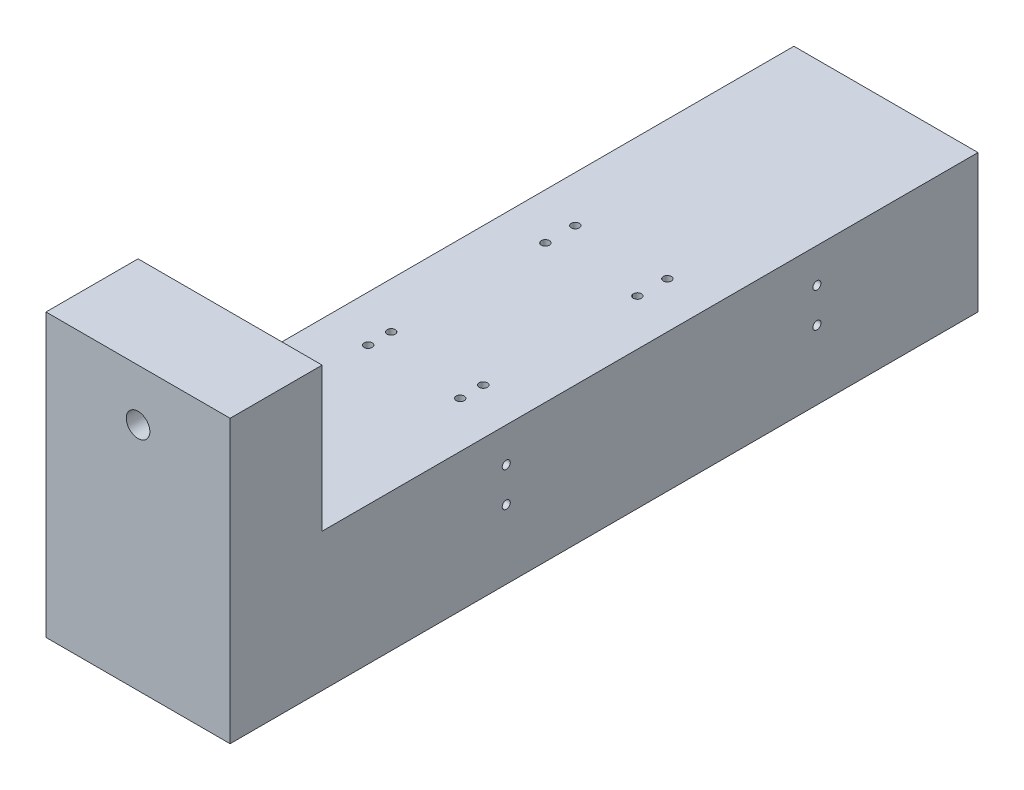
ISO-10303-21;
HEADER;
FILE_DESCRIPTION(('STEP AP214'),'2;1');
FILE_NAME('part.step','',(''),(''),'','','');
FILE_SCHEMA(('AUTOMOTIVE_DESIGN { 1 0 10303 214 1 1 1 1 }'));
ENDSEC;
DATA;
#1=APPLICATION_CONTEXT('core data for automotive mechanical design processes');
#2=APPLICATION_PROTOCOL_DEFINITION('international standard','automotive_design',2000,#1);
#3=PRODUCT_CONTEXT('',#1,'mechanical');
#4=PRODUCT('Part','Part','',(#3));
#5=PRODUCT_RELATED_PRODUCT_CATEGORY('part','',(#4));
#6=PRODUCT_DEFINITION_FORMATION('','',#4);
#7=PRODUCT_DEFINITION_CONTEXT('part definition',#1,'design');
#8=PRODUCT_DEFINITION('design','',#6,#7);
#9=PRODUCT_DEFINITION_SHAPE('','',#8);
#10=(LENGTH_UNIT() NAMED_UNIT(*) SI_UNIT(.MILLI.,.METRE.));
#11=(NAMED_UNIT(*) PLANE_ANGLE_UNIT() SI_UNIT($,.RADIAN.));
#12=(NAMED_UNIT(*) SI_UNIT($,.STERADIAN.) SOLID_ANGLE_UNIT());
#13=UNCERTAINTY_MEASURE_WITH_UNIT(LENGTH_MEASURE(1.E-05),#10,'distance_accuracy_value','');
#14=(GEOMETRIC_REPRESENTATION_CONTEXT(3) GLOBAL_UNCERTAINTY_ASSIGNED_CONTEXT((#13)) GLOBAL_UNIT_ASSIGNED_CONTEXT((#10,
#11,#12)) REPRESENTATION_CONTEXT('',''));
#15=CARTESIAN_POINT('',(0.,0.,0.));
#16=DIRECTION('',(0.,0.,1.));
#17=DIRECTION('',(1.,0.,0.));
#18=AXIS2_PLACEMENT_3D('',#15,#16,#17);
#19=CARTESIAN_POINT('',(80.,29.618320610687,570.));
#20=DIRECTION('',(-1.,0.,0.));
#21=DIRECTION('',(0.,0.,1.));
#22=AXIS2_PLACEMENT_3D('',#19,#20,#21);
#23=PLANE('',#22);
#24=CARTESIAN_POINT('',(80.,119.618320610687,140.));
#25=DIRECTION('',(1.,0.,0.));
#26=DIRECTION('',(0.,0.,-1.));
#27=AXIS2_PLACEMENT_3D('',#24,#25,#26);
#28=CIRCLE('',#27,3.5);
#29=CARTESIAN_POINT('',(80.,119.618320610687,136.5));
#30=VERTEX_POINT('',#29);
#31=EDGE_CURVE('E272',#30,#30,#28,.T.);
#32=ORIENTED_EDGE('',*,*,#31,.F.);
#33=EDGE_LOOP('',(#32));
#34=FACE_BOUND('',#33,.T.);
#35=CARTESIAN_POINT('',(80.,89.618320610687,140.));
#36=DIRECTION('',(1.,0.,0.));
#37=DIRECTION('',(0.,0.,-1.));
#38=AXIS2_PLACEMENT_3D('',#35,#36,#37);
#39=CIRCLE('',#38,3.5);
#40=CARTESIAN_POINT('',(80.,89.618320610687,136.5));
#41=VERTEX_POINT('',#40);
#42=EDGE_CURVE('E279',#41,#41,#39,.T.);
#43=ORIENTED_EDGE('',*,*,#42,.F.);
#44=EDGE_LOOP('',(#43));
#45=FACE_BOUND('',#44,.T.);
#46=CARTESIAN_POINT('',(80.,119.618320610687,410.));
#47=DIRECTION('',(1.,0.,0.));
#48=DIRECTION('',(0.,0.,-1.));
#49=AXIS2_PLACEMENT_3D('',#46,#47,#48);
#50=CIRCLE('',#49,3.5);
#51=CARTESIAN_POINT('',(80.,119.618320610687,406.5));
#52=VERTEX_POINT('',#51);
#53=EDGE_CURVE('E287',#52,#52,#50,.T.);
#54=ORIENTED_EDGE('',*,*,#53,.F.);
#55=EDGE_LOOP('',(#54));
#56=FACE_BOUND('',#55,.T.);
#57=CARTESIAN_POINT('',(80.,89.618320610687,410.));
#58=DIRECTION('',(1.,0.,0.));
#59=DIRECTION('',(0.,0.,-1.));
#60=AXIS2_PLACEMENT_3D('',#57,#58,#59);
#61=CIRCLE('',#60,3.5);
#62=CARTESIAN_POINT('',(80.,89.618320610687,406.5));
#63=VERTEX_POINT('',#62);
#64=EDGE_CURVE('E295',#63,#63,#61,.T.);
#65=ORIENTED_EDGE('',*,*,#64,.F.);
#66=EDGE_LOOP('',(#65));
#67=FACE_BOUND('',#66,.T.);
#68=DIRECTION('',(0.,1.,0.));
#69=VECTOR('',#68,1.);
#70=CARTESIAN_POINT('',(80.,29.618320610687,0.));
#71=LINE('',#70,#69);
#72=CARTESIAN_POINT('',(80.,29.618320610687,0.));
#73=VERTEX_POINT('',#72);
#74=CARTESIAN_POINT('',(80.,149.618320610687,0.));
#75=VERTEX_POINT('',#74);
#76=EDGE_CURVE('E105',#73,#75,#71,.T.);
#77=ORIENTED_EDGE('',*,*,#76,.T.);
#78=DIRECTION('',(0.,0.,-1.));
#79=VECTOR('',#78,1.);
#80=CARTESIAN_POINT('',(80.,149.618320610687,570.));
#81=LINE('',#80,#79);
#82=CARTESIAN_POINT('',(80.,149.618320610687,570.));
#83=VERTEX_POINT('',#82);
#84=EDGE_CURVE('E11',#83,#75,#81,.T.);
#85=ORIENTED_EDGE('',*,*,#84,.F.);
#86=DIRECTION('',(0.,1.,0.));
#87=VECTOR('',#86,1.);
#88=CARTESIAN_POINT('',(80.,29.618320610687,570.));
#89=LINE('',#88,#87);
#90=CARTESIAN_POINT('',(80.,274.618320610687,570.));
#91=VERTEX_POINT('',#90);
#92=EDGE_CURVE('E127',#83,#91,#89,.T.);
#93=ORIENTED_EDGE('',*,*,#92,.T.);
#94=DIRECTION('',(0.,0.,-1.));
#95=VECTOR('',#94,1.);
#96=CARTESIAN_POINT('',(80.,274.618320610687,650.));
#97=LINE('',#96,#95);
#98=CARTESIAN_POINT('',(80.,274.618320610687,650.));
#99=VERTEX_POINT('',#98);
#100=EDGE_CURVE('E125',#99,#91,#97,.T.);
#101=ORIENTED_EDGE('',*,*,#100,.F.);
#102=DIRECTION('',(0.,1.,0.));
#103=VECTOR('',#102,1.);
#104=CARTESIAN_POINT('',(80.,29.618320610687,650.));
#105=LINE('',#104,#103);
#106=CARTESIAN_POINT('',(80.,29.618320610687,650.));
#107=VERTEX_POINT('',#106);
#108=EDGE_CURVE('E115',#107,#99,#105,.T.);
#109=ORIENTED_EDGE('',*,*,#108,.F.);
#110=DIRECTION('',(0.,0.,-1.));
#111=VECTOR('',#110,1.);
#112=CARTESIAN_POINT('',(80.,29.618320610687,570.));
#113=LINE('',#112,#111);
#114=EDGE_CURVE('E100',#107,#73,#113,.T.);
#115=ORIENTED_EDGE('',*,*,#114,.T.);
#116=EDGE_LOOP('',(#77,#85,#93,#101,#109,#115));
#117=FACE_BOUND('',#116,.T.);
#118=ADVANCED_FACE('F44',(#34,#45,#56,#67,#117),#23,.F.);
#119=CARTESIAN_POINT('',(-80.,149.618320610687,570.));
#120=DIRECTION('',(0.,-1.,0.));
#121=DIRECTION('',(0.,0.,-1.));
#122=AXIS2_PLACEMENT_3D('',#119,#120,#121);
#123=PLANE('',#122);
#124=CARTESIAN_POINT('',(40.,149.618320610687,410.));
#125=DIRECTION('',(0.,1.,0.));
#126=DIRECTION('',(0.,0.,1.));
#127=AXIS2_PLACEMENT_3D('',#124,#125,#126);
#128=CIRCLE('',#127,3.5);
#129=CARTESIAN_POINT('',(40.,149.618320610687,413.5));
#130=VERTEX_POINT('',#129);
#131=EDGE_CURVE('E297',#130,#130,#128,.T.);
#132=ORIENTED_EDGE('',*,*,#131,.F.);
#133=EDGE_LOOP('',(#132));
#134=FACE_BOUND('',#133,.T.);
#135=CARTESIAN_POINT('',(40.,149.618320610687,390.));
#136=DIRECTION('',(0.,1.,0.));
#137=DIRECTION('',(0.,0.,1.));
#138=AXIS2_PLACEMENT_3D('',#135,#136,#137);
#139=CIRCLE('',#138,3.5);
#140=CARTESIAN_POINT('',(40.,149.618320610687,393.5));
#141=VERTEX_POINT('',#140);
#142=EDGE_CURVE('E304',#141,#141,#139,.T.);
#143=ORIENTED_EDGE('',*,*,#142,.F.);
#144=EDGE_LOOP('',(#143));
#145=FACE_BOUND('',#144,.T.);
#146=CARTESIAN_POINT('',(40.,149.618320610687,256.));
#147=DIRECTION('',(0.,1.,0.));
#148=DIRECTION('',(0.,0.,1.));
#149=AXIS2_PLACEMENT_3D('',#146,#147,#148);
#150=CIRCLE('',#149,3.5);
#151=CARTESIAN_POINT('',(40.,149.618320610687,259.5));
#152=VERTEX_POINT('',#151);
#153=EDGE_CURVE('E308',#152,#152,#150,.T.);
#154=ORIENTED_EDGE('',*,*,#153,.F.);
#155=EDGE_LOOP('',(#154));
#156=FACE_BOUND('',#155,.T.);
#157=CARTESIAN_POINT('',(40.,149.618320610687,230.));
#158=DIRECTION('',(0.,1.,0.));
#159=DIRECTION('',(0.,0.,1.));
#160=AXIS2_PLACEMENT_3D('',#157,#158,#159);
#161=CIRCLE('',#160,3.5);
#162=CARTESIAN_POINT('',(40.,149.618320610687,233.5));
#163=VERTEX_POINT('',#162);
#164=EDGE_CURVE('E316',#163,#163,#161,.T.);
#165=ORIENTED_EDGE('',*,*,#164,.F.);
#166=EDGE_LOOP('',(#165));
#167=FACE_BOUND('',#166,.T.);
#168=CARTESIAN_POINT('',(-40.,149.618320610687,410.));
#169=DIRECTION('',(0.,1.,0.));
#170=DIRECTION('',(0.,0.,1.));
#171=AXIS2_PLACEMENT_3D('',#168,#169,#170);
#172=CIRCLE('',#171,3.5);
#173=CARTESIAN_POINT('',(-40.,149.618320610687,413.5));
#174=VERTEX_POINT('',#173);
#175=EDGE_CURVE('E325',#174,#174,#172,.T.);
#176=ORIENTED_EDGE('',*,*,#175,.F.);
#177=EDGE_LOOP('',(#176));
#178=FACE_BOUND('',#177,.T.);
#179=CARTESIAN_POINT('',(-40.,149.618320610687,390.));
#180=DIRECTION('',(0.,1.,0.));
#181=DIRECTION('',(0.,0.,1.));
#182=AXIS2_PLACEMENT_3D('',#179,#180,#181);
#183=CIRCLE('',#182,3.5);
#184=CARTESIAN_POINT('',(-40.,149.618320610687,393.5));
#185=VERTEX_POINT('',#184);
#186=EDGE_CURVE('E328',#185,#185,#183,.T.);
#187=ORIENTED_EDGE('',*,*,#186,.F.);
#188=EDGE_LOOP('',(#187));
#189=FACE_BOUND('',#188,.T.);
#190=CARTESIAN_POINT('',(-40.,149.618320610687,256.));
#191=DIRECTION('',(0.,1.,0.));
#192=DIRECTION('',(0.,0.,1.));
#193=AXIS2_PLACEMENT_3D('',#190,#191,#192);
#194=CIRCLE('',#193,3.5);
#195=CARTESIAN_POINT('',(-40.,149.618320610687,259.5));
#196=VERTEX_POINT('',#195);
#197=EDGE_CURVE('E335',#196,#196,#194,.T.);
#198=ORIENTED_EDGE('',*,*,#197,.F.);
#199=EDGE_LOOP('',(#198));
#200=FACE_BOUND('',#199,.T.);
#201=CARTESIAN_POINT('',(-40.,149.618320610687,230.));
#202=DIRECTION('',(0.,1.,0.));
#203=DIRECTION('',(0.,0.,1.));
#204=AXIS2_PLACEMENT_3D('',#201,#202,#203);
#205=CIRCLE('',#204,3.5);
#206=CARTESIAN_POINT('',(-40.,149.618320610687,233.5));
#207=VERTEX_POINT('',#206);
#208=EDGE_CURVE('E337',#207,#207,#205,.T.);
#209=ORIENTED_EDGE('',*,*,#208,.F.);
#210=EDGE_LOOP('',(#209));
#211=FACE_BOUND('',#210,.T.);
#212=DIRECTION('',(-1.,0.,0.));
#213=VECTOR('',#212,1.);
#214=CARTESIAN_POINT('',(-80.,149.618320610687,0.));
#215=LINE('',#214,#213);
#216=CARTESIAN_POINT('',(-80.,149.618320610687,0.));
#217=VERTEX_POINT('',#216);
#218=EDGE_CURVE('E89',#75,#217,#215,.T.);
#219=ORIENTED_EDGE('',*,*,#218,.T.);
#220=DIRECTION('',(0.,0.,-1.));
#221=VECTOR('',#220,1.);
#222=CARTESIAN_POINT('',(-80.,149.618320610687,570.));
#223=LINE('',#222,#221);
#224=CARTESIAN_POINT('',(-80.,149.618320610687,570.));
#225=VERTEX_POINT('',#224);
#226=EDGE_CURVE('E52',#225,#217,#223,.T.);
#227=ORIENTED_EDGE('',*,*,#226,.F.);
#228=DIRECTION('',(-1.,0.,0.));
#229=VECTOR('',#228,1.);
#230=CARTESIAN_POINT('',(-80.,149.618320610687,570.));
#231=LINE('',#230,#229);
#232=EDGE_CURVE('E56',#83,#225,#231,.T.);
#233=ORIENTED_EDGE('',*,*,#232,.F.);
#234=ORIENTED_EDGE('',*,*,#84,.T.);
#235=EDGE_LOOP('',(#219,#227,#233,#234));
#236=FACE_BOUND('',#235,.T.);
#237=ADVANCED_FACE('F136',(#134,#145,#156,#167,#178,#189,#200,#211,#236),#123,.F.);
#238=CARTESIAN_POINT('',(-80.,29.618320610687,570.));
#239=DIRECTION('',(1.,0.,0.));
#240=DIRECTION('',(0.,0.,-1.));
#241=AXIS2_PLACEMENT_3D('',#238,#239,#240);
#242=PLANE('',#241);
#243=CARTESIAN_POINT('',(-80.,119.618320610687,410.));
#244=DIRECTION('',(-1.,0.,0.));
#245=DIRECTION('',(0.,0.,1.));
#246=AXIS2_PLACEMENT_3D('',#243,#244,#245);
#247=CIRCLE('',#246,3.5);
#248=CARTESIAN_POINT('',(-80.,119.618320610687,413.5));
#249=VERTEX_POINT('',#248);
#250=EDGE_CURVE('E249',#249,#249,#247,.T.);
#251=ORIENTED_EDGE('',*,*,#250,.F.);
#252=EDGE_LOOP('',(#251));
#253=FACE_BOUND('',#252,.T.);
#254=CARTESIAN_POINT('',(-80.,89.618320610687,140.));
#255=DIRECTION('',(-1.,0.,0.));
#256=DIRECTION('',(0.,0.,1.));
#257=AXIS2_PLACEMENT_3D('',#254,#255,#256);
#258=CIRCLE('',#257,3.5);
#259=CARTESIAN_POINT('',(-80.,89.618320610687,143.5));
#260=VERTEX_POINT('',#259);
#261=EDGE_CURVE('E258',#260,#260,#258,.T.);
#262=ORIENTED_EDGE('',*,*,#261,.F.);
#263=EDGE_LOOP('',(#262));
#264=FACE_BOUND('',#263,.T.);
#265=CARTESIAN_POINT('',(-80.,89.618320610687,410.));
#266=DIRECTION('',(-1.,0.,0.));
#267=DIRECTION('',(0.,0.,1.));
#268=AXIS2_PLACEMENT_3D('',#265,#266,#267);
#269=CIRCLE('',#268,3.5);
#270=CARTESIAN_POINT('',(-80.,89.618320610687,413.5));
#271=VERTEX_POINT('',#270);
#272=EDGE_CURVE('E265',#271,#271,#269,.T.);
#273=ORIENTED_EDGE('',*,*,#272,.F.);
#274=EDGE_LOOP('',(#273));
#275=FACE_BOUND('',#274,.T.);
#276=CARTESIAN_POINT('',(-80.,119.618320610687,140.));
#277=DIRECTION('',(-1.,0.,0.));
#278=DIRECTION('',(0.,0.,1.));
#279=AXIS2_PLACEMENT_3D('',#276,#277,#278);
#280=CIRCLE('',#279,3.5);
#281=CARTESIAN_POINT('',(-80.,119.618320610687,143.5));
#282=VERTEX_POINT('',#281);
#283=EDGE_CURVE('E268',#282,#282,#280,.T.);
#284=ORIENTED_EDGE('',*,*,#283,.F.);
#285=EDGE_LOOP('',(#284));
#286=FACE_BOUND('',#285,.T.);
#287=DIRECTION('',(0.,-1.,0.));
#288=VECTOR('',#287,1.);
#289=CARTESIAN_POINT('',(-80.,29.618320610687,0.));
#290=LINE('',#289,#288);
#291=CARTESIAN_POINT('',(-80.,29.618320610687,0.));
#292=VERTEX_POINT('',#291);
#293=EDGE_CURVE('E80',#217,#292,#290,.T.);
#294=ORIENTED_EDGE('',*,*,#293,.T.);
#295=DIRECTION('',(0.,0.,-1.));
#296=VECTOR('',#295,1.);
#297=CARTESIAN_POINT('',(-80.,29.618320610687,570.));
#298=LINE('',#297,#296);
#299=CARTESIAN_POINT('',(-80.,29.618320610687,650.));
#300=VERTEX_POINT('',#299);
#301=EDGE_CURVE('E85',#300,#292,#298,.T.);
#302=ORIENTED_EDGE('',*,*,#301,.F.);
#303=DIRECTION('',(0.,-1.,0.));
#304=VECTOR('',#303,1.);
#305=CARTESIAN_POINT('',(-80.,29.618320610687,650.));
#306=LINE('',#305,#304);
#307=CARTESIAN_POINT('',(-80.,274.618320610687,650.));
#308=VERTEX_POINT('',#307);
#309=EDGE_CURVE('E118',#308,#300,#306,.T.);
#310=ORIENTED_EDGE('',*,*,#309,.F.);
#311=DIRECTION('',(0.,0.,-1.));
#312=VECTOR('',#311,1.);
#313=CARTESIAN_POINT('',(-80.,274.618320610687,650.));
#314=LINE('',#313,#312);
#315=CARTESIAN_POINT('',(-80.,274.618320610687,570.));
#316=VERTEX_POINT('',#315);
#317=EDGE_CURVE('E117',#308,#316,#314,.T.);
#318=ORIENTED_EDGE('',*,*,#317,.T.);
#319=DIRECTION('',(0.,-1.,0.));
#320=VECTOR('',#319,1.);
#321=CARTESIAN_POINT('',(-80.,29.618320610687,570.));
#322=LINE('',#321,#320);
#323=EDGE_CURVE('E133',#316,#225,#322,.T.);
#324=ORIENTED_EDGE('',*,*,#323,.T.);
#325=ORIENTED_EDGE('',*,*,#226,.T.);
#326=EDGE_LOOP('',(#294,#302,#310,#318,#324,#325));
#327=FACE_BOUND('',#326,.T.);
#328=ADVANCED_FACE('F79',(#253,#264,#275,#286,#327),#242,.F.);
#329=CARTESIAN_POINT('',(-80.,29.618320610687,570.));
#330=DIRECTION('',(0.,1.,0.));
#331=DIRECTION('',(0.,0.,1.));
#332=AXIS2_PLACEMENT_3D('',#329,#330,#331);
#333=PLANE('',#332);
#334=DIRECTION('',(1.,0.,0.));
#335=VECTOR('',#334,1.);
#336=CARTESIAN_POINT('',(-80.,29.618320610687,0.));
#337=LINE('',#336,#335);
#338=EDGE_CURVE('E90',#292,#73,#337,.T.);
#339=ORIENTED_EDGE('',*,*,#338,.T.);
#340=ORIENTED_EDGE('',*,*,#114,.F.);
#341=DIRECTION('',(1.,0.,0.));
#342=VECTOR('',#341,1.);
#343=CARTESIAN_POINT('',(-80.,29.618320610687,650.));
#344=LINE('',#343,#342);
#345=EDGE_CURVE('E96',#300,#107,#344,.T.);
#346=ORIENTED_EDGE('',*,*,#345,.F.);
#347=ORIENTED_EDGE('',*,*,#301,.T.);
#348=EDGE_LOOP('',(#339,#340,#346,#347));
#349=FACE_BOUND('',#348,.T.);
#350=ADVANCED_FACE('F95',(#349),#333,.F.);
#351=CARTESIAN_POINT('',(0.,0.,0.));
#352=DIRECTION('',(0.,0.,-1.));
#353=DIRECTION('',(-1.,0.,0.));
#354=AXIS2_PLACEMENT_3D('',#351,#352,#353);
#355=PLANE('',#354);
#356=CARTESIAN_POINT('',(50.,119.618320610687,0.));
#357=DIRECTION('',(0.,0.,-1.));
#358=DIRECTION('',(-1.,0.,0.));
#359=AXIS2_PLACEMENT_3D('',#356,#357,#358);
#360=CIRCLE('',#359,5.09999999999999);
#361=CARTESIAN_POINT('',(44.9,119.618320610687,0.));
#362=VERTEX_POINT('',#361);
#363=EDGE_CURVE('E228',#362,#362,#360,.T.);
#364=ORIENTED_EDGE('',*,*,#363,.F.);
#365=EDGE_LOOP('',(#364));
#366=FACE_BOUND('',#365,.T.);
#367=CARTESIAN_POINT('',(-50.,119.618320610687,0.));
#368=DIRECTION('',(0.,0.,-1.));
#369=DIRECTION('',(-1.,0.,0.));
#370=AXIS2_PLACEMENT_3D('',#367,#368,#369);
#371=CIRCLE('',#370,5.09999999999999);
#372=CARTESIAN_POINT('',(-55.1,119.618320610687,0.));
#373=VERTEX_POINT('',#372);
#374=EDGE_CURVE('E230',#373,#373,#371,.T.);
#375=ORIENTED_EDGE('',*,*,#374,.F.);
#376=EDGE_LOOP('',(#375));
#377=FACE_BOUND('',#376,.T.);
#378=CARTESIAN_POINT('',(-50.,59.618320610687,0.));
#379=DIRECTION('',(0.,0.,-1.));
#380=DIRECTION('',(-1.,0.,0.));
#381=AXIS2_PLACEMENT_3D('',#378,#379,#380);
#382=CIRCLE('',#381,5.09999999999999);
#383=CARTESIAN_POINT('',(-55.1,59.618320610687,0.));
#384=VERTEX_POINT('',#383);
#385=EDGE_CURVE('E239',#384,#384,#382,.T.);
#386=ORIENTED_EDGE('',*,*,#385,.F.);
#387=EDGE_LOOP('',(#386));
#388=FACE_BOUND('',#387,.T.);
#389=CARTESIAN_POINT('',(50.,59.618320610687,0.));
#390=DIRECTION('',(0.,0.,-1.));
#391=DIRECTION('',(-1.,0.,0.));
#392=AXIS2_PLACEMENT_3D('',#389,#390,#391);
#393=CIRCLE('',#392,5.09999999999999);
#394=CARTESIAN_POINT('',(44.9,59.618320610687,0.));
#395=VERTEX_POINT('',#394);
#396=EDGE_CURVE('E243',#395,#395,#393,.T.);
#397=ORIENTED_EDGE('',*,*,#396,.F.);
#398=EDGE_LOOP('',(#397));
#399=FACE_BOUND('',#398,.T.);
#400=ORIENTED_EDGE('',*,*,#76,.F.);
#401=ORIENTED_EDGE('',*,*,#338,.F.);
#402=ORIENTED_EDGE('',*,*,#293,.F.);
#403=ORIENTED_EDGE('',*,*,#218,.F.);
#404=EDGE_LOOP('',(#400,#401,#402,#403));
#405=FACE_BOUND('',#404,.T.);
#406=ADVANCED_FACE('F99',(#366,#377,#388,#399,#405),#355,.T.);
#407=CARTESIAN_POINT('',(-80.,274.618320610687,650.));
#408=DIRECTION('',(0.,-1.,0.));
#409=DIRECTION('',(0.,0.,-1.));
#410=AXIS2_PLACEMENT_3D('',#407,#408,#409);
#411=PLANE('',#410);
#412=DIRECTION('',(-1.,0.,0.));
#413=VECTOR('',#412,1.);
#414=CARTESIAN_POINT('',(-80.,274.618320610687,570.));
#415=LINE('',#414,#413);
#416=EDGE_CURVE('E132',#91,#316,#415,.T.);
#417=ORIENTED_EDGE('',*,*,#416,.T.);
#418=ORIENTED_EDGE('',*,*,#317,.F.);
#419=DIRECTION('',(-1.,0.,0.));
#420=VECTOR('',#419,1.);
#421=CARTESIAN_POINT('',(-80.,274.618320610687,650.));
#422=LINE('',#421,#420);
#423=EDGE_CURVE('E122',#99,#308,#422,.T.);
#424=ORIENTED_EDGE('',*,*,#423,.F.);
#425=ORIENTED_EDGE('',*,*,#100,.T.);
#426=EDGE_LOOP('',(#417,#418,#424,#425));
#427=FACE_BOUND('',#426,.T.);
#428=ADVANCED_FACE('F155',(#427),#411,.F.);
#429=CARTESIAN_POINT('',(0.,0.,650.));
#430=DIRECTION('',(0.,0.,-1.));
#431=DIRECTION('',(-1.,0.,0.));
#432=AXIS2_PLACEMENT_3D('',#429,#430,#431);
#433=PLANE('',#432);
#434=CARTESIAN_POINT('',(0.,229.618320610687,650.));
#435=DIRECTION('',(0.,0.,1.));
#436=DIRECTION('',(1.,0.,0.));
#437=AXIS2_PLACEMENT_3D('',#434,#435,#436);
#438=CIRCLE('',#437,10.25);
#439=CARTESIAN_POINT('',(10.25,229.618320610687,650.));
#440=VERTEX_POINT('',#439);
#441=EDGE_CURVE('E346',#440,#440,#438,.T.);
#442=ORIENTED_EDGE('',*,*,#441,.F.);
#443=EDGE_LOOP('',(#442));
#444=FACE_BOUND('',#443,.T.);
#445=ORIENTED_EDGE('',*,*,#108,.T.);
#446=ORIENTED_EDGE('',*,*,#423,.T.);
#447=ORIENTED_EDGE('',*,*,#309,.T.);
#448=ORIENTED_EDGE('',*,*,#345,.T.);
#449=EDGE_LOOP('',(#445,#446,#447,#448));
#450=FACE_BOUND('',#449,.T.);
#451=ADVANCED_FACE('F112',(#444,#450),#433,.F.);
#452=CARTESIAN_POINT('',(0.,0.,570.));
#453=DIRECTION('',(0.,0.,-1.));
#454=DIRECTION('',(-1.,0.,0.));
#455=AXIS2_PLACEMENT_3D('',#452,#453,#454);
#456=PLANE('',#455);
#457=CARTESIAN_POINT('',(0.,229.618320610687,570.));
#458=DIRECTION('',(0.,0.,-1.));
#459=DIRECTION('',(-1.,0.,0.));
#460=AXIS2_PLACEMENT_3D('',#457,#458,#459);
#461=CIRCLE('',#460,10.2499999999999);
#462=CARTESIAN_POINT('',(-10.2499999999999,229.618320610687,570.));
#463=VERTEX_POINT('',#462);
#464=EDGE_CURVE('E135',#463,#463,#461,.T.);
#465=ORIENTED_EDGE('',*,*,#464,.F.);
#466=EDGE_LOOP('',(#465));
#467=FACE_BOUND('',#466,.T.);
#468=ORIENTED_EDGE('',*,*,#92,.F.);
#469=ORIENTED_EDGE('',*,*,#232,.T.);
#470=ORIENTED_EDGE('',*,*,#323,.F.);
#471=ORIENTED_EDGE('',*,*,#416,.F.);
#472=EDGE_LOOP('',(#468,#469,#470,#471));
#473=FACE_BOUND('',#472,.T.);
#474=ADVANCED_FACE('F143',(#467,#473),#456,.T.);
#475=CARTESIAN_POINT('',(0.,229.618320610687,650.));
#476=DIRECTION('',(0.,0.,1.));
#477=DIRECTION('',(1.,0.,0.));
#478=AXIS2_PLACEMENT_3D('',#475,#476,#477);
#479=CYLINDRICAL_SURFACE('',#478,10.2499999999999);
#480=ORIENTED_EDGE('',*,*,#464,.T.);
#481=EDGE_LOOP('',(#480));
#482=FACE_BOUND('',#481,.T.);
#483=ORIENTED_EDGE('',*,*,#441,.T.);
#484=EDGE_LOOP('',(#483));
#485=FACE_BOUND('',#484,.T.);
#486=ADVANCED_FACE('F352',(#482,#485),#479,.F.);
#487=CARTESIAN_POINT('',(-40.,129.618320610687,230.));
#488=DIRECTION('',(0.,1.,0.));
#489=DIRECTION('',(0.,0.,1.));
#490=AXIS2_PLACEMENT_3D('',#487,#488,#489);
#491=CONICAL_SURFACE('',#490,3.5,1.02974425867665);
#492=CARTESIAN_POINT('',(-40.,127.515308444091,230.));
#493=VERTEX_POINT('',#492);
#494=VERTEX_LOOP('',#493);
#495=FACE_BOUND('',#494,.T.);
#496=CARTESIAN_POINT('',(-40.,129.618320610687,230.));
#497=DIRECTION('',(0.,1.,0.));
#498=DIRECTION('',(0.,0.,1.));
#499=AXIS2_PLACEMENT_3D('',#496,#497,#498);
#500=CIRCLE('',#499,3.5);
#501=CARTESIAN_POINT('',(-40.,129.618320610687,233.5));
#502=VERTEX_POINT('',#501);
#503=EDGE_CURVE('E343',#502,#502,#500,.T.);
#504=ORIENTED_EDGE('',*,*,#503,.T.);
#505=EDGE_LOOP('',(#504));
#506=FACE_BOUND('',#505,.T.);
#507=ADVANCED_FACE('F364',(#495,#506),#491,.F.);
#508=CARTESIAN_POINT('',(-40.,149.618320610687,230.));
#509=DIRECTION('',(0.,1.,0.));
#510=DIRECTION('',(0.,0.,1.));
#511=AXIS2_PLACEMENT_3D('',#508,#509,#510);
#512=CYLINDRICAL_SURFACE('',#511,3.5);
#513=ORIENTED_EDGE('',*,*,#503,.F.);
#514=EDGE_LOOP('',(#513));
#515=FACE_BOUND('',#514,.T.);
#516=ORIENTED_EDGE('',*,*,#208,.T.);
#517=EDGE_LOOP('',(#516));
#518=FACE_BOUND('',#517,.T.);
#519=ADVANCED_FACE('F460',(#515,#518),#512,.F.);
#520=CARTESIAN_POINT('',(-40.,129.618320610687,256.));
#521=DIRECTION('',(0.,1.,0.));
#522=DIRECTION('',(0.,0.,1.));
#523=AXIS2_PLACEMENT_3D('',#520,#521,#522);
#524=CONICAL_SURFACE('',#523,3.5,1.02974425867665);
#525=CARTESIAN_POINT('',(-40.,127.515308444091,256.));
#526=VERTEX_POINT('',#525);
#527=VERTEX_LOOP('',#526);
#528=FACE_BOUND('',#527,.T.);
#529=CARTESIAN_POINT('',(-40.,129.618320610687,256.));
#530=DIRECTION('',(0.,1.,0.));
#531=DIRECTION('',(0.,0.,1.));
#532=AXIS2_PLACEMENT_3D('',#529,#530,#531);
#533=CIRCLE('',#532,3.5);
#534=CARTESIAN_POINT('',(-40.,129.618320610687,259.5));
#535=VERTEX_POINT('',#534);
#536=EDGE_CURVE('E340',#535,#535,#533,.T.);
#537=ORIENTED_EDGE('',*,*,#536,.T.);
#538=EDGE_LOOP('',(#537));
#539=FACE_BOUND('',#538,.T.);
#540=ADVANCED_FACE('F453',(#528,#539),#524,.F.);
#541=CARTESIAN_POINT('',(-40.,149.618320610687,256.));
#542=DIRECTION('',(0.,1.,0.));
#543=DIRECTION('',(0.,0.,1.));
#544=AXIS2_PLACEMENT_3D('',#541,#542,#543);
#545=CYLINDRICAL_SURFACE('',#544,3.5);
#546=ORIENTED_EDGE('',*,*,#536,.F.);
#547=EDGE_LOOP('',(#546));
#548=FACE_BOUND('',#547,.T.);
#549=ORIENTED_EDGE('',*,*,#197,.T.);
#550=EDGE_LOOP('',(#549));
#551=FACE_BOUND('',#550,.T.);
#552=ADVANCED_FACE('F448',(#548,#551),#545,.F.);
#553=CARTESIAN_POINT('',(-40.,129.618320610687,390.));
#554=DIRECTION('',(0.,1.,0.));
#555=DIRECTION('',(0.,0.,1.));
#556=AXIS2_PLACEMENT_3D('',#553,#554,#555);
#557=CONICAL_SURFACE('',#556,3.5,1.02974425867665);
#558=CARTESIAN_POINT('',(-40.0000000000001,127.515308444091,390.));
#559=VERTEX_POINT('',#558);
#560=VERTEX_LOOP('',#559);
#561=FACE_BOUND('',#560,.T.);
#562=CARTESIAN_POINT('',(-40.,129.618320610687,390.));
#563=DIRECTION('',(0.,1.,0.));
#564=DIRECTION('',(0.,0.,1.));
#565=AXIS2_PLACEMENT_3D('',#562,#563,#564);
#566=CIRCLE('',#565,3.5);
#567=CARTESIAN_POINT('',(-40.,129.618320610687,393.5));
#568=VERTEX_POINT('',#567);
#569=EDGE_CURVE('E333',#568,#568,#566,.T.);
#570=ORIENTED_EDGE('',*,*,#569,.T.);
#571=EDGE_LOOP('',(#570));
#572=FACE_BOUND('',#571,.T.);
#573=ADVANCED_FACE('F444',(#561,#572),#557,.F.);
#574=CARTESIAN_POINT('',(-40.,149.618320610687,390.));
#575=DIRECTION('',(0.,1.,0.));
#576=DIRECTION('',(0.,0.,1.));
#577=AXIS2_PLACEMENT_3D('',#574,#575,#576);
#578=CYLINDRICAL_SURFACE('',#577,3.5);
#579=ORIENTED_EDGE('',*,*,#569,.F.);
#580=EDGE_LOOP('',(#579));
#581=FACE_BOUND('',#580,.T.);
#582=ORIENTED_EDGE('',*,*,#186,.T.);
#583=EDGE_LOOP('',(#582));
#584=FACE_BOUND('',#583,.T.);
#585=ADVANCED_FACE('F441',(#581,#584),#578,.F.);
#586=CARTESIAN_POINT('',(-40.,129.618320610687,410.));
#587=DIRECTION('',(0.,1.,0.));
#588=DIRECTION('',(0.,0.,1.));
#589=AXIS2_PLACEMENT_3D('',#586,#587,#588);
#590=CONICAL_SURFACE('',#589,3.5,1.02974425867665);
#591=CARTESIAN_POINT('',(-40.0000000000001,127.515308444091,410.));
#592=VERTEX_POINT('',#591);
#593=VERTEX_LOOP('',#592);
#594=FACE_BOUND('',#593,.T.);
#595=CARTESIAN_POINT('',(-40.,129.618320610687,410.));
#596=DIRECTION('',(0.,1.,0.));
#597=DIRECTION('',(0.,0.,1.));
#598=AXIS2_PLACEMENT_3D('',#595,#596,#597);
#599=CIRCLE('',#598,3.5);
#600=CARTESIAN_POINT('',(-40.,129.618320610687,413.5));
#601=VERTEX_POINT('',#600);
#602=EDGE_CURVE('E324',#601,#601,#599,.T.);
#603=ORIENTED_EDGE('',*,*,#602,.T.);
#604=EDGE_LOOP('',(#603));
#605=FACE_BOUND('',#604,.T.);
#606=ADVANCED_FACE('F440',(#594,#605),#590,.F.);
#607=CARTESIAN_POINT('',(-40.,149.618320610687,410.));
#608=DIRECTION('',(0.,1.,0.));
#609=DIRECTION('',(0.,0.,1.));
#610=AXIS2_PLACEMENT_3D('',#607,#608,#609);
#611=CYLINDRICAL_SURFACE('',#610,3.5);
#612=ORIENTED_EDGE('',*,*,#602,.F.);
#613=EDGE_LOOP('',(#612));
#614=FACE_BOUND('',#613,.T.);
#615=ORIENTED_EDGE('',*,*,#175,.T.);
#616=EDGE_LOOP('',(#615));
#617=FACE_BOUND('',#616,.T.);
#618=ADVANCED_FACE('F434',(#614,#617),#611,.F.);
#619=CARTESIAN_POINT('',(40.,129.618320610687,230.));
#620=DIRECTION('',(0.,1.,0.));
#621=DIRECTION('',(0.,0.,1.));
#622=AXIS2_PLACEMENT_3D('',#619,#620,#621);
#623=CONICAL_SURFACE('',#622,3.5,1.02974425867665);
#624=CARTESIAN_POINT('',(40.,127.515308444091,230.));
#625=VERTEX_POINT('',#624);
#626=VERTEX_LOOP('',#625);
#627=FACE_BOUND('',#626,.T.);
#628=CARTESIAN_POINT('',(40.,129.618320610687,230.));
#629=DIRECTION('',(0.,1.,0.));
#630=DIRECTION('',(0.,0.,1.));
#631=AXIS2_PLACEMENT_3D('',#628,#629,#630);
#632=CIRCLE('',#631,3.5);
#633=CARTESIAN_POINT('',(40.,129.618320610687,233.5));
#634=VERTEX_POINT('',#633);
#635=EDGE_CURVE('E318',#634,#634,#632,.T.);
#636=ORIENTED_EDGE('',*,*,#635,.T.);
#637=EDGE_LOOP('',(#636));
#638=FACE_BOUND('',#637,.T.);
#639=ADVANCED_FACE('F428',(#627,#638),#623,.F.);
#640=CARTESIAN_POINT('',(40.,149.618320610687,230.));
#641=DIRECTION('',(0.,1.,0.));
#642=DIRECTION('',(0.,0.,1.));
#643=AXIS2_PLACEMENT_3D('',#640,#641,#642);
#644=CYLINDRICAL_SURFACE('',#643,3.5);
#645=ORIENTED_EDGE('',*,*,#635,.F.);
#646=EDGE_LOOP('',(#645));
#647=FACE_BOUND('',#646,.T.);
#648=ORIENTED_EDGE('',*,*,#164,.T.);
#649=EDGE_LOOP('',(#648));
#650=FACE_BOUND('',#649,.T.);
#651=ADVANCED_FACE('F424',(#647,#650),#644,.F.);
#652=CARTESIAN_POINT('',(40.,129.618320610687,256.));
#653=DIRECTION('',(0.,1.,0.));
#654=DIRECTION('',(0.,0.,1.));
#655=AXIS2_PLACEMENT_3D('',#652,#653,#654);
#656=CONICAL_SURFACE('',#655,3.5,1.02974425867665);
#657=CARTESIAN_POINT('',(40.,127.515308444091,256.));
#658=VERTEX_POINT('',#657);
#659=VERTEX_LOOP('',#658);
#660=FACE_BOUND('',#659,.T.);
#661=CARTESIAN_POINT('',(40.,129.618320610687,256.));
#662=DIRECTION('',(0.,1.,0.));
#663=DIRECTION('',(0.,0.,1.));
#664=AXIS2_PLACEMENT_3D('',#661,#662,#663);
#665=CIRCLE('',#664,3.5);
#666=CARTESIAN_POINT('',(40.,129.618320610687,259.5));
#667=VERTEX_POINT('',#666);
#668=EDGE_CURVE('E314',#667,#667,#665,.T.);
#669=ORIENTED_EDGE('',*,*,#668,.T.);
#670=EDGE_LOOP('',(#669));
#671=FACE_BOUND('',#670,.T.);
#672=ADVANCED_FACE('F421',(#660,#671),#656,.F.);
#673=CARTESIAN_POINT('',(40.,149.618320610687,256.));
#674=DIRECTION('',(0.,1.,0.));
#675=DIRECTION('',(0.,0.,1.));
#676=AXIS2_PLACEMENT_3D('',#673,#674,#675);
#677=CYLINDRICAL_SURFACE('',#676,3.5);
#678=ORIENTED_EDGE('',*,*,#668,.F.);
#679=EDGE_LOOP('',(#678));
#680=FACE_BOUND('',#679,.T.);
#681=ORIENTED_EDGE('',*,*,#153,.T.);
#682=EDGE_LOOP('',(#681));
#683=FACE_BOUND('',#682,.T.);
#684=ADVANCED_FACE('F420',(#680,#683),#677,.F.);
#685=CARTESIAN_POINT('',(40.,129.618320610687,390.));
#686=DIRECTION('',(0.,1.,0.));
#687=DIRECTION('',(0.,0.,1.));
#688=AXIS2_PLACEMENT_3D('',#685,#686,#687);
#689=CONICAL_SURFACE('',#688,3.5,1.02974425867665);
#690=CARTESIAN_POINT('',(40.,127.515308444091,390.));
#691=VERTEX_POINT('',#690);
#692=VERTEX_LOOP('',#691);
#693=FACE_BOUND('',#692,.T.);
#694=CARTESIAN_POINT('',(40.,129.618320610687,390.));
#695=DIRECTION('',(0.,1.,0.));
#696=DIRECTION('',(0.,0.,1.));
#697=AXIS2_PLACEMENT_3D('',#694,#695,#696);
#698=CIRCLE('',#697,3.5);
#699=CARTESIAN_POINT('',(40.,129.618320610687,393.5));
#700=VERTEX_POINT('',#699);
#701=EDGE_CURVE('E310',#700,#700,#698,.T.);
#702=ORIENTED_EDGE('',*,*,#701,.T.);
#703=EDGE_LOOP('',(#702));
#704=FACE_BOUND('',#703,.T.);
#705=ADVANCED_FACE('F411',(#693,#704),#689,.F.);
#706=CARTESIAN_POINT('',(40.,149.618320610687,390.));
#707=DIRECTION('',(0.,1.,0.));
#708=DIRECTION('',(0.,0.,1.));
#709=AXIS2_PLACEMENT_3D('',#706,#707,#708);
#710=CYLINDRICAL_SURFACE('',#709,3.5);
#711=ORIENTED_EDGE('',*,*,#701,.F.);
#712=EDGE_LOOP('',(#711));
#713=FACE_BOUND('',#712,.T.);
#714=ORIENTED_EDGE('',*,*,#142,.T.);
#715=EDGE_LOOP('',(#714));
#716=FACE_BOUND('',#715,.T.);
#717=ADVANCED_FACE('F410',(#713,#716),#710,.F.);
#718=CARTESIAN_POINT('',(40.,129.618320610687,410.));
#719=DIRECTION('',(0.,1.,0.));
#720=DIRECTION('',(0.,0.,1.));
#721=AXIS2_PLACEMENT_3D('',#718,#719,#720);
#722=CONICAL_SURFACE('',#721,3.5,1.02974425867665);
#723=CARTESIAN_POINT('',(40.,127.515308444091,410.));
#724=VERTEX_POINT('',#723);
#725=VERTEX_LOOP('',#724);
#726=FACE_BOUND('',#725,.T.);
#727=CARTESIAN_POINT('',(40.,129.618320610687,410.));
#728=DIRECTION('',(0.,1.,0.));
#729=DIRECTION('',(0.,0.,1.));
#730=AXIS2_PLACEMENT_3D('',#727,#728,#729);
#731=CIRCLE('',#730,3.5);
#732=CARTESIAN_POINT('',(40.,129.618320610687,413.5));
#733=VERTEX_POINT('',#732);
#734=EDGE_CURVE('E302',#733,#733,#731,.T.);
#735=ORIENTED_EDGE('',*,*,#734,.T.);
#736=EDGE_LOOP('',(#735));
#737=FACE_BOUND('',#736,.T.);
#738=ADVANCED_FACE('F401',(#726,#737),#722,.F.);
#739=CARTESIAN_POINT('',(40.,149.618320610687,410.));
#740=DIRECTION('',(0.,1.,0.));
#741=DIRECTION('',(0.,0.,1.));
#742=AXIS2_PLACEMENT_3D('',#739,#740,#741);
#743=CYLINDRICAL_SURFACE('',#742,3.5);
#744=ORIENTED_EDGE('',*,*,#734,.F.);
#745=EDGE_LOOP('',(#744));
#746=FACE_BOUND('',#745,.T.);
#747=ORIENTED_EDGE('',*,*,#131,.T.);
#748=EDGE_LOOP('',(#747));
#749=FACE_BOUND('',#748,.T.);
#750=ADVANCED_FACE('F400',(#746,#749),#743,.F.);
#751=CARTESIAN_POINT('',(60.,89.618320610687,410.));
#752=DIRECTION('',(1.,0.,0.));
#753=DIRECTION('',(0.,0.,-1.));
#754=AXIS2_PLACEMENT_3D('',#751,#752,#753);
#755=CONICAL_SURFACE('',#754,3.49999999999999,1.02974425867665);
#756=CARTESIAN_POINT('',(57.8969878334035,89.618320610687,410.));
#757=VERTEX_POINT('',#756);
#758=VERTEX_LOOP('',#757);
#759=FACE_BOUND('',#758,.T.);
#760=CARTESIAN_POINT('',(60.,89.618320610687,410.));
#761=DIRECTION('',(1.,0.,0.));
#762=DIRECTION('',(0.,0.,-1.));
#763=AXIS2_PLACEMENT_3D('',#760,#761,#762);
#764=CIRCLE('',#763,3.49999999999999);
#765=CARTESIAN_POINT('',(60.,89.618320610687,406.5));
#766=VERTEX_POINT('',#765);
#767=EDGE_CURVE('E294',#766,#766,#764,.T.);
#768=ORIENTED_EDGE('',*,*,#767,.T.);
#769=EDGE_LOOP('',(#768));
#770=FACE_BOUND('',#769,.T.);
#771=ADVANCED_FACE('F387',(#759,#770),#755,.F.);
#772=CARTESIAN_POINT('',(80.,89.618320610687,410.));
#773=DIRECTION('',(1.,0.,0.));
#774=DIRECTION('',(0.,0.,-1.));
#775=AXIS2_PLACEMENT_3D('',#772,#773,#774);
#776=CYLINDRICAL_SURFACE('',#775,3.5);
#777=ORIENTED_EDGE('',*,*,#767,.F.);
#778=EDGE_LOOP('',(#777));
#779=FACE_BOUND('',#778,.T.);
#780=ORIENTED_EDGE('',*,*,#64,.T.);
#781=EDGE_LOOP('',(#780));
#782=FACE_BOUND('',#781,.T.);
#783=ADVANCED_FACE('F384',(#779,#782),#776,.F.);
#784=CARTESIAN_POINT('',(60.,119.618320610687,410.));
#785=DIRECTION('',(1.,0.,0.));
#786=DIRECTION('',(0.,0.,-1.));
#787=AXIS2_PLACEMENT_3D('',#784,#785,#786);
#788=CONICAL_SURFACE('',#787,3.49999999999999,1.02974425867665);
#789=CARTESIAN_POINT('',(57.8969878334035,119.618320610687,410.));
#790=VERTEX_POINT('',#789);
#791=VERTEX_LOOP('',#790);
#792=FACE_BOUND('',#791,.T.);
#793=CARTESIAN_POINT('',(60.,119.618320610687,410.));
#794=DIRECTION('',(1.,0.,0.));
#795=DIRECTION('',(0.,0.,-1.));
#796=AXIS2_PLACEMENT_3D('',#793,#794,#795);
#797=CIRCLE('',#796,3.49999999999999);
#798=CARTESIAN_POINT('',(60.,119.618320610687,406.5));
#799=VERTEX_POINT('',#798);
#800=EDGE_CURVE('E286',#799,#799,#797,.T.);
#801=ORIENTED_EDGE('',*,*,#800,.T.);
#802=EDGE_LOOP('',(#801));
#803=FACE_BOUND('',#802,.T.);
#804=ADVANCED_FACE('F383',(#792,#803),#788,.F.);
#805=CARTESIAN_POINT('',(80.,119.618320610687,410.));
#806=DIRECTION('',(1.,0.,0.));
#807=DIRECTION('',(0.,0.,-1.));
#808=AXIS2_PLACEMENT_3D('',#805,#806,#807);
#809=CYLINDRICAL_SURFACE('',#808,3.5);
#810=ORIENTED_EDGE('',*,*,#800,.F.);
#811=EDGE_LOOP('',(#810));
#812=FACE_BOUND('',#811,.T.);
#813=ORIENTED_EDGE('',*,*,#53,.T.);
#814=EDGE_LOOP('',(#813));
#815=FACE_BOUND('',#814,.T.);
#816=ADVANCED_FACE('F392',(#812,#815),#809,.F.);
#817=CARTESIAN_POINT('',(60.,89.618320610687,140.));
#818=DIRECTION('',(1.,0.,0.));
#819=DIRECTION('',(0.,0.,-1.));
#820=AXIS2_PLACEMENT_3D('',#817,#818,#819);
#821=CONICAL_SURFACE('',#820,3.49999999999999,1.02974425867665);
#822=CARTESIAN_POINT('',(57.8969878334035,89.618320610687,140.));
#823=VERTEX_POINT('',#822);
#824=VERTEX_LOOP('',#823);
#825=FACE_BOUND('',#824,.T.);
#826=CARTESIAN_POINT('',(60.,89.618320610687,140.));
#827=DIRECTION('',(1.,0.,0.));
#828=DIRECTION('',(0.,0.,-1.));
#829=AXIS2_PLACEMENT_3D('',#826,#827,#828);
#830=CIRCLE('',#829,3.49999999999999);
#831=CARTESIAN_POINT('',(60.,89.618320610687,136.5));
#832=VERTEX_POINT('',#831);
#833=EDGE_CURVE('E284',#832,#832,#830,.T.);
#834=ORIENTED_EDGE('',*,*,#833,.T.);
#835=EDGE_LOOP('',(#834));
#836=FACE_BOUND('',#835,.T.);
#837=ADVANCED_FACE('F622',(#825,#836),#821,.F.);
#838=CARTESIAN_POINT('',(80.,89.618320610687,140.));
#839=DIRECTION('',(1.,0.,0.));
#840=DIRECTION('',(0.,0.,-1.));
#841=AXIS2_PLACEMENT_3D('',#838,#839,#840);
#842=CYLINDRICAL_SURFACE('',#841,3.5);
#843=ORIENTED_EDGE('',*,*,#833,.F.);
#844=EDGE_LOOP('',(#843));
#845=FACE_BOUND('',#844,.T.);
#846=ORIENTED_EDGE('',*,*,#42,.T.);
#847=EDGE_LOOP('',(#846));
#848=FACE_BOUND('',#847,.T.);
#849=ADVANCED_FACE('F635',(#845,#848),#842,.F.);
#850=CARTESIAN_POINT('',(60.,119.618320610687,140.));
#851=DIRECTION('',(1.,0.,0.));
#852=DIRECTION('',(0.,0.,-1.));
#853=AXIS2_PLACEMENT_3D('',#850,#851,#852);
#854=CONICAL_SURFACE('',#853,3.49999999999999,1.02974425867665);
#855=CARTESIAN_POINT('',(57.8969878334035,119.618320610687,140.));
#856=VERTEX_POINT('',#855);
#857=VERTEX_LOOP('',#856);
#858=FACE_BOUND('',#857,.T.);
#859=CARTESIAN_POINT('',(60.,119.618320610687,140.));
#860=DIRECTION('',(1.,0.,0.));
#861=DIRECTION('',(0.,0.,-1.));
#862=AXIS2_PLACEMENT_3D('',#859,#860,#861);
#863=CIRCLE('',#862,3.49999999999999);
#864=CARTESIAN_POINT('',(60.,119.618320610687,136.5));
#865=VERTEX_POINT('',#864);
#866=EDGE_CURVE('E280',#865,#865,#863,.T.);
#867=ORIENTED_EDGE('',*,*,#866,.T.);
#868=EDGE_LOOP('',(#867));
#869=FACE_BOUND('',#868,.T.);
#870=ADVANCED_FACE('F642',(#858,#869),#854,.F.);
#871=CARTESIAN_POINT('',(80.,119.618320610687,140.));
#872=DIRECTION('',(1.,0.,0.));
#873=DIRECTION('',(0.,0.,-1.));
#874=AXIS2_PLACEMENT_3D('',#871,#872,#873);
#875=CYLINDRICAL_SURFACE('',#874,3.5);
#876=ORIENTED_EDGE('',*,*,#866,.F.);
#877=EDGE_LOOP('',(#876));
#878=FACE_BOUND('',#877,.T.);
#879=ORIENTED_EDGE('',*,*,#31,.T.);
#880=EDGE_LOOP('',(#879));
#881=FACE_BOUND('',#880,.T.);
#882=ADVANCED_FACE('F654',(#878,#881),#875,.F.);
#883=CARTESIAN_POINT('',(-60.,119.618320610687,140.));
#884=DIRECTION('',(-1.,0.,0.));
#885=DIRECTION('',(0.,0.,1.));
#886=AXIS2_PLACEMENT_3D('',#883,#884,#885);
#887=CONICAL_SURFACE('',#886,3.49999999999999,1.02974425867665);
#888=CARTESIAN_POINT('',(-57.8969878334035,119.618320610687,140.));
#889=VERTEX_POINT('',#888);
#890=VERTEX_LOOP('',#889);
#891=FACE_BOUND('',#890,.T.);
#892=CARTESIAN_POINT('',(-60.,119.618320610687,140.));
#893=DIRECTION('',(-1.,0.,0.));
#894=DIRECTION('',(0.,0.,1.));
#895=AXIS2_PLACEMENT_3D('',#892,#893,#894);
#896=CIRCLE('',#895,3.49999999999999);
#897=CARTESIAN_POINT('',(-60.,119.618320610687,143.5));
#898=VERTEX_POINT('',#897);
#899=EDGE_CURVE('E271',#898,#898,#896,.T.);
#900=ORIENTED_EDGE('',*,*,#899,.T.);
#901=EDGE_LOOP('',(#900));
#902=FACE_BOUND('',#901,.T.);
#903=ADVANCED_FACE('F663',(#891,#902),#887,.F.);
#904=CARTESIAN_POINT('',(-80.,119.618320610687,140.));
#905=DIRECTION('',(-1.,0.,0.));
#906=DIRECTION('',(0.,0.,1.));
#907=AXIS2_PLACEMENT_3D('',#904,#905,#906);
#908=CYLINDRICAL_SURFACE('',#907,3.5);
#909=ORIENTED_EDGE('',*,*,#899,.F.);
#910=EDGE_LOOP('',(#909));
#911=FACE_BOUND('',#910,.T.);
#912=ORIENTED_EDGE('',*,*,#283,.T.);
#913=EDGE_LOOP('',(#912));
#914=FACE_BOUND('',#913,.T.);
#915=ADVANCED_FACE('F686',(#911,#914),#908,.F.);
#916=CARTESIAN_POINT('',(-60.,89.618320610687,410.));
#917=DIRECTION('',(-1.,0.,0.));
#918=DIRECTION('',(0.,0.,1.));
#919=AXIS2_PLACEMENT_3D('',#916,#917,#918);
#920=CONICAL_SURFACE('',#919,3.49999999999999,1.02974425867665);
#921=CARTESIAN_POINT('',(-57.8969878334035,89.618320610687,410.));
#922=VERTEX_POINT('',#921);
#923=VERTEX_LOOP('',#922);
#924=FACE_BOUND('',#923,.T.);
#925=CARTESIAN_POINT('',(-60.,89.618320610687,410.));
#926=DIRECTION('',(-1.,0.,0.));
#927=DIRECTION('',(0.,0.,1.));
#928=AXIS2_PLACEMENT_3D('',#925,#926,#927);
#929=CIRCLE('',#928,3.49999999999999);
#930=CARTESIAN_POINT('',(-60.,89.618320610687,413.5));
#931=VERTEX_POINT('',#930);
#932=EDGE_CURVE('E262',#931,#931,#929,.T.);
#933=ORIENTED_EDGE('',*,*,#932,.T.);
#934=EDGE_LOOP('',(#933));
#935=FACE_BOUND('',#934,.T.);
#936=ADVANCED_FACE('F699',(#924,#935),#920,.F.);
#937=CARTESIAN_POINT('',(-80.,89.618320610687,410.));
#938=DIRECTION('',(-1.,0.,0.));
#939=DIRECTION('',(0.,0.,1.));
#940=AXIS2_PLACEMENT_3D('',#937,#938,#939);
#941=CYLINDRICAL_SURFACE('',#940,3.5);
#942=ORIENTED_EDGE('',*,*,#932,.F.);
#943=EDGE_LOOP('',(#942));
#944=FACE_BOUND('',#943,.T.);
#945=ORIENTED_EDGE('',*,*,#272,.T.);
#946=EDGE_LOOP('',(#945));
#947=FACE_BOUND('',#946,.T.);
#948=ADVANCED_FACE('F715',(#944,#947),#941,.F.);
#949=CARTESIAN_POINT('',(-60.,89.618320610687,140.));
#950=DIRECTION('',(-1.,0.,0.));
#951=DIRECTION('',(0.,0.,1.));
#952=AXIS2_PLACEMENT_3D('',#949,#950,#951);
#953=CONICAL_SURFACE('',#952,3.49999999999999,1.02974425867665);
#954=CARTESIAN_POINT('',(-57.8969878334035,89.618320610687,140.));
#955=VERTEX_POINT('',#954);
#956=VERTEX_LOOP('',#955);
#957=FACE_BOUND('',#956,.T.);
#958=CARTESIAN_POINT('',(-60.,89.618320610687,140.));
#959=DIRECTION('',(-1.,0.,0.));
#960=DIRECTION('',(0.,0.,1.));
#961=AXIS2_PLACEMENT_3D('',#958,#959,#960);
#962=CIRCLE('',#961,3.49999999999999);
#963=CARTESIAN_POINT('',(-60.,89.618320610687,143.5));
#964=VERTEX_POINT('',#963);
#965=EDGE_CURVE('E260',#964,#964,#962,.T.);
#966=ORIENTED_EDGE('',*,*,#965,.T.);
#967=EDGE_LOOP('',(#966));
#968=FACE_BOUND('',#967,.T.);
#969=ADVANCED_FACE('F725',(#957,#968),#953,.F.);
#970=CARTESIAN_POINT('',(-80.,89.618320610687,140.));
#971=DIRECTION('',(-1.,0.,0.));
#972=DIRECTION('',(0.,0.,1.));
#973=AXIS2_PLACEMENT_3D('',#970,#971,#972);
#974=CYLINDRICAL_SURFACE('',#973,3.5);
#975=ORIENTED_EDGE('',*,*,#965,.F.);
#976=EDGE_LOOP('',(#975));
#977=FACE_BOUND('',#976,.T.);
#978=ORIENTED_EDGE('',*,*,#261,.T.);
#979=EDGE_LOOP('',(#978));
#980=FACE_BOUND('',#979,.T.);
#981=ADVANCED_FACE('F731',(#977,#980),#974,.F.);
#982=CARTESIAN_POINT('',(-60.,119.618320610687,410.));
#983=DIRECTION('',(-1.,0.,0.));
#984=DIRECTION('',(0.,0.,1.));
#985=AXIS2_PLACEMENT_3D('',#982,#983,#984);
#986=CONICAL_SURFACE('',#985,3.49999999999999,1.02974425867665);
#987=CARTESIAN_POINT('',(-57.8969878334035,119.618320610687,410.));
#988=VERTEX_POINT('',#987);
#989=VERTEX_LOOP('',#988);
#990=FACE_BOUND('',#989,.T.);
#991=CARTESIAN_POINT('',(-60.,119.618320610687,410.));
#992=DIRECTION('',(-1.,0.,0.));
#993=DIRECTION('',(0.,0.,1.));
#994=AXIS2_PLACEMENT_3D('',#991,#992,#993);
#995=CIRCLE('',#994,3.49999999999999);
#996=CARTESIAN_POINT('',(-60.,119.618320610687,413.5));
#997=VERTEX_POINT('',#996);
#998=EDGE_CURVE('E253',#997,#997,#995,.T.);
#999=ORIENTED_EDGE('',*,*,#998,.T.);
#1000=EDGE_LOOP('',(#999));
#1001=FACE_BOUND('',#1000,.T.);
#1002=ADVANCED_FACE('F743',(#990,#1001),#986,.F.);
#1003=CARTESIAN_POINT('',(-80.,119.618320610687,410.));
#1004=DIRECTION('',(-1.,0.,0.));
#1005=DIRECTION('',(0.,0.,1.));
#1006=AXIS2_PLACEMENT_3D('',#1003,#1004,#1005);
#1007=CYLINDRICAL_SURFACE('',#1006,3.5);
#1008=ORIENTED_EDGE('',*,*,#998,.F.);
#1009=EDGE_LOOP('',(#1008));
#1010=FACE_BOUND('',#1009,.T.);
#1011=ORIENTED_EDGE('',*,*,#250,.T.);
#1012=EDGE_LOOP('',(#1011));
#1013=FACE_BOUND('',#1012,.T.);
#1014=ADVANCED_FACE('F751',(#1010,#1013),#1007,.F.);
#1015=CARTESIAN_POINT('',(50.,59.618320610687,30.));
#1016=DIRECTION('',(0.,0.,-1.));
#1017=DIRECTION('',(-1.,0.,0.));
#1018=AXIS2_PLACEMENT_3D('',#1015,#1016,#1017);
#1019=CONICAL_SURFACE('',#1018,5.09999999999999,1.02974425867665);
#1020=CARTESIAN_POINT('',(50.,59.618320610687,33.0643891570405));
#1021=VERTEX_POINT('',#1020);
#1022=VERTEX_LOOP('',#1021);
#1023=FACE_BOUND('',#1022,.T.);
#1024=CARTESIAN_POINT('',(50.,59.618320610687,30.));
#1025=DIRECTION('',(0.,0.,-1.));
#1026=DIRECTION('',(-1.,0.,0.));
#1027=AXIS2_PLACEMENT_3D('',#1024,#1025,#1026);
#1028=CIRCLE('',#1027,5.09999999999999);
#1029=CARTESIAN_POINT('',(44.9,59.618320610687,30.));
#1030=VERTEX_POINT('',#1029);
#1031=EDGE_CURVE('E250',#1030,#1030,#1028,.T.);
#1032=ORIENTED_EDGE('',*,*,#1031,.T.);
#1033=EDGE_LOOP('',(#1032));
#1034=FACE_BOUND('',#1033,.T.);
#1035=ADVANCED_FACE('F763',(#1023,#1034),#1019,.F.);
#1036=CARTESIAN_POINT('',(50.,59.618320610687,0.));
#1037=DIRECTION('',(0.,0.,-1.));
#1038=DIRECTION('',(-1.,0.,0.));
#1039=AXIS2_PLACEMENT_3D('',#1036,#1037,#1038);
#1040=CYLINDRICAL_SURFACE('',#1039,5.09999999999999);
#1041=ORIENTED_EDGE('',*,*,#1031,.F.);
#1042=EDGE_LOOP('',(#1041));
#1043=FACE_BOUND('',#1042,.T.);
#1044=ORIENTED_EDGE('',*,*,#396,.T.);
#1045=EDGE_LOOP('',(#1044));
#1046=FACE_BOUND('',#1045,.T.);
#1047=ADVANCED_FACE('F789',(#1043,#1046),#1040,.F.);
#1048=CARTESIAN_POINT('',(-50.,59.618320610687,30.));
#1049=DIRECTION('',(0.,0.,-1.));
#1050=DIRECTION('',(-1.,0.,0.));
#1051=AXIS2_PLACEMENT_3D('',#1048,#1049,#1050);
#1052=CONICAL_SURFACE('',#1051,5.09999999999999,1.02974425867665);
#1053=CARTESIAN_POINT('',(-50.,59.618320610687,33.0643891570405));
#1054=VERTEX_POINT('',#1053);
#1055=VERTEX_LOOP('',#1054);
#1056=FACE_BOUND('',#1055,.T.);
#1057=CARTESIAN_POINT('',(-50.,59.618320610687,30.));
#1058=DIRECTION('',(0.,0.,-1.));
#1059=DIRECTION('',(-1.,0.,0.));
#1060=AXIS2_PLACEMENT_3D('',#1057,#1058,#1059);
#1061=CIRCLE('',#1060,5.09999999999999);
#1062=CARTESIAN_POINT('',(-55.1,59.618320610687,30.));
#1063=VERTEX_POINT('',#1062);
#1064=EDGE_CURVE('E241',#1063,#1063,#1061,.T.);
#1065=ORIENTED_EDGE('',*,*,#1064,.T.);
#1066=EDGE_LOOP('',(#1065));
#1067=FACE_BOUND('',#1066,.T.);
#1068=ADVANCED_FACE('F797',(#1056,#1067),#1052,.F.);
#1069=CARTESIAN_POINT('',(-50.,59.618320610687,0.));
#1070=DIRECTION('',(0.,0.,-1.));
#1071=DIRECTION('',(-1.,0.,0.));
#1072=AXIS2_PLACEMENT_3D('',#1069,#1070,#1071);
#1073=CYLINDRICAL_SURFACE('',#1072,5.09999999999999);
#1074=ORIENTED_EDGE('',*,*,#1064,.F.);
#1075=EDGE_LOOP('',(#1074));
#1076=FACE_BOUND('',#1075,.T.);
#1077=ORIENTED_EDGE('',*,*,#385,.T.);
#1078=EDGE_LOOP('',(#1077));
#1079=FACE_BOUND('',#1078,.T.);
#1080=ADVANCED_FACE('F808',(#1076,#1079),#1073,.F.);
#1081=CARTESIAN_POINT('',(-50.,119.618320610687,30.));
#1082=DIRECTION('',(0.,0.,-1.));
#1083=DIRECTION('',(-1.,0.,0.));
#1084=AXIS2_PLACEMENT_3D('',#1081,#1082,#1083);
#1085=CONICAL_SURFACE('',#1084,5.09999999999999,1.02974425867665);
#1086=CARTESIAN_POINT('',(-50.,119.618320610687,33.0643891570405));
#1087=VERTEX_POINT('',#1086);
#1088=VERTEX_LOOP('',#1087);
#1089=FACE_BOUND('',#1088,.T.);
#1090=CARTESIAN_POINT('',(-50.,119.618320610687,30.));
#1091=DIRECTION('',(0.,0.,-1.));
#1092=DIRECTION('',(-1.,0.,0.));
#1093=AXIS2_PLACEMENT_3D('',#1090,#1091,#1092);
#1094=CIRCLE('',#1093,5.09999999999999);
#1095=CARTESIAN_POINT('',(-55.1,119.618320610687,30.));
#1096=VERTEX_POINT('',#1095);
#1097=EDGE_CURVE('E232',#1096,#1096,#1094,.T.);
#1098=ORIENTED_EDGE('',*,*,#1097,.T.);
#1099=EDGE_LOOP('',(#1098));
#1100=FACE_BOUND('',#1099,.T.);
#1101=ADVANCED_FACE('F819',(#1089,#1100),#1085,.F.);
#1102=CARTESIAN_POINT('',(-50.,119.618320610687,0.));
#1103=DIRECTION('',(0.,0.,-1.));
#1104=DIRECTION('',(-1.,0.,0.));
#1105=AXIS2_PLACEMENT_3D('',#1102,#1103,#1104);
#1106=CYLINDRICAL_SURFACE('',#1105,5.09999999999999);
#1107=ORIENTED_EDGE('',*,*,#1097,.F.);
#1108=EDGE_LOOP('',(#1107));
#1109=FACE_BOUND('',#1108,.T.);
#1110=ORIENTED_EDGE('',*,*,#374,.T.);
#1111=EDGE_LOOP('',(#1110));
#1112=FACE_BOUND('',#1111,.T.);
#1113=ADVANCED_FACE('F221',(#1109,#1112),#1106,.F.);
#1114=CARTESIAN_POINT('',(50.,119.618320610687,30.));
#1115=DIRECTION('',(0.,0.,-1.));
#1116=DIRECTION('',(-1.,0.,0.));
#1117=AXIS2_PLACEMENT_3D('',#1114,#1115,#1116);
#1118=CONICAL_SURFACE('',#1117,5.09999999999999,1.02974425867665);
#1119=CARTESIAN_POINT('',(50.,119.618320610687,33.0643891570405));
#1120=VERTEX_POINT('',#1119);
#1121=VERTEX_LOOP('',#1120);
#1122=FACE_BOUND('',#1121,.T.);
#1123=CARTESIAN_POINT('',(50.,119.618320610687,30.));
#1124=DIRECTION('',(0.,0.,-1.));
#1125=DIRECTION('',(-1.,0.,0.));
#1126=AXIS2_PLACEMENT_3D('',#1123,#1124,#1125);
#1127=CIRCLE('',#1126,5.09999999999999);
#1128=CARTESIAN_POINT('',(44.9,119.618320610687,30.));
#1129=VERTEX_POINT('',#1128);
#1130=EDGE_CURVE('E224',#1129,#1129,#1127,.T.);
#1131=ORIENTED_EDGE('',*,*,#1130,.T.);
#1132=EDGE_LOOP('',(#1131));
#1133=FACE_BOUND('',#1132,.T.);
#1134=ADVANCED_FACE('F220',(#1122,#1133),#1118,.F.);
#1135=CARTESIAN_POINT('',(50.,119.618320610687,0.));
#1136=DIRECTION('',(0.,0.,-1.));
#1137=DIRECTION('',(-1.,0.,0.));
#1138=AXIS2_PLACEMENT_3D('',#1135,#1136,#1137);
#1139=CYLINDRICAL_SURFACE('',#1138,5.09999999999999);
#1140=ORIENTED_EDGE('',*,*,#1130,.F.);
#1141=EDGE_LOOP('',(#1140));
#1142=FACE_BOUND('',#1141,.T.);
#1143=ORIENTED_EDGE('',*,*,#363,.T.);
#1144=EDGE_LOOP('',(#1143));
#1145=FACE_BOUND('',#1144,.T.);
#1146=ADVANCED_FACE('F219',(#1142,#1145),#1139,.F.);
#1147=CLOSED_SHELL('',(#118,#237,#328,#350,#406,#428,#451,#474,#486,#507,#519,#540,#552,#573,
#585,#606,#618,#639,#651,#672,#684,#705,#717,#738,#750,#771,#783,#804,#816,#837,#849,#870,#882,
#903,#915,#936,#948,#969,#981,#1002,#1014,#1035,#1047,#1068,#1080,#1101,#1113,#1134,#1146));
#1148=MANIFOLD_SOLID_BREP('B2',#1147);
#1149=ADVANCED_BREP_SHAPE_REPRESENTATION('',(#18,#1148),#14);
#1150=SHAPE_DEFINITION_REPRESENTATION(#9,#1149);
ENDSEC;
END-ISO-10303-21;
